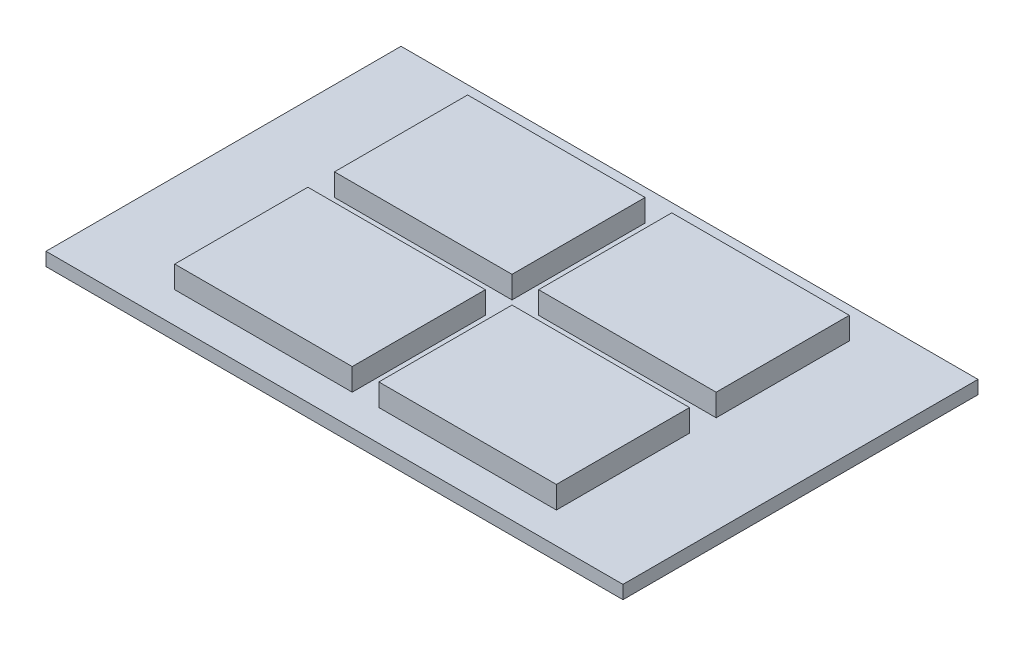
ISO-10303-21;
HEADER;
FILE_DESCRIPTION(('STEP AP214'),'2;1');
FILE_NAME('part.step','',(''),(''),'','','');
FILE_SCHEMA(('AUTOMOTIVE_DESIGN { 1 0 10303 214 1 1 1 1 }'));
ENDSEC;
DATA;
#1=APPLICATION_CONTEXT('core data for automotive mechanical design processes');
#2=APPLICATION_PROTOCOL_DEFINITION('international standard','automotive_design',2000,#1);
#3=PRODUCT_CONTEXT('',#1,'mechanical');
#4=PRODUCT('Part','Part','',(#3));
#5=PRODUCT_RELATED_PRODUCT_CATEGORY('part','',(#4));
#6=PRODUCT_DEFINITION_FORMATION('','',#4);
#7=PRODUCT_DEFINITION_CONTEXT('part definition',#1,'design');
#8=PRODUCT_DEFINITION('design','',#6,#7);
#9=PRODUCT_DEFINITION_SHAPE('','',#8);
#10=(LENGTH_UNIT() NAMED_UNIT(*) SI_UNIT(.MILLI.,.METRE.));
#11=(NAMED_UNIT(*) PLANE_ANGLE_UNIT() SI_UNIT($,.RADIAN.));
#12=(NAMED_UNIT(*) SI_UNIT($,.STERADIAN.) SOLID_ANGLE_UNIT());
#13=UNCERTAINTY_MEASURE_WITH_UNIT(LENGTH_MEASURE(1.E-05),#10,'distance_accuracy_value','');
#14=(GEOMETRIC_REPRESENTATION_CONTEXT(3) GLOBAL_UNCERTAINTY_ASSIGNED_CONTEXT((#13)) GLOBAL_UNIT_ASSIGNED_CONTEXT((#10,
#11,#12)) REPRESENTATION_CONTEXT('',''));
#15=CARTESIAN_POINT('',(0.,0.,0.));
#16=DIRECTION('',(0.,0.,1.));
#17=DIRECTION('',(1.,0.,0.));
#18=AXIS2_PLACEMENT_3D('',#15,#16,#17);
#19=CARTESIAN_POINT('',(0.,3.,0.));
#20=DIRECTION('',(0.,-1.,0.));
#21=DIRECTION('',(0.,0.,-1.));
#22=AXIS2_PLACEMENT_3D('',#19,#20,#21);
#23=PLANE('',#22);
#24=DIRECTION('',(0.,0.,-1.));
#25=VECTOR('',#24,1.);
#26=CARTESIAN_POINT('',(43.,3.,33.));
#27=LINE('',#26,#25);
#28=CARTESIAN_POINT('',(43.,3.,33.));
#29=VERTEX_POINT('',#28);
#30=CARTESIAN_POINT('',(43.,3.,2.99999999999999));
#31=VERTEX_POINT('',#30);
#32=EDGE_CURVE('E201',#29,#31,#27,.T.);
#33=ORIENTED_EDGE('',*,*,#32,.F.);
#34=DIRECTION('',(1.,0.,0.));
#35=VECTOR('',#34,1.);
#36=CARTESIAN_POINT('',(43.,3.,33.));
#37=LINE('',#36,#35);
#38=CARTESIAN_POINT('',(2.99999999999998,3.,33.));
#39=VERTEX_POINT('',#38);
#40=EDGE_CURVE('E217',#39,#29,#37,.T.);
#41=ORIENTED_EDGE('',*,*,#40,.F.);
#42=DIRECTION('',(0.,0.,1.));
#43=VECTOR('',#42,1.);
#44=CARTESIAN_POINT('',(2.99999999999998,3.,33.));
#45=LINE('',#44,#43);
#46=CARTESIAN_POINT('',(2.99999999999999,3.,2.99999999999997));
#47=VERTEX_POINT('',#46);
#48=EDGE_CURVE('E230',#47,#39,#45,.T.);
#49=ORIENTED_EDGE('',*,*,#48,.F.);
#50=DIRECTION('',(-1.,0.,0.));
#51=VECTOR('',#50,1.);
#52=CARTESIAN_POINT('',(43.,3.,2.99999999999999));
#53=LINE('',#52,#51);
#54=EDGE_CURVE('E206',#31,#47,#53,.T.);
#55=ORIENTED_EDGE('',*,*,#54,.F.);
#56=EDGE_LOOP('',(#33,#41,#49,#55));
#57=FACE_BOUND('',#56,.T.);
#58=DIRECTION('',(0.,0.,-1.));
#59=VECTOR('',#58,1.);
#60=CARTESIAN_POINT('',(-3.,3.,-33.));
#61=LINE('',#60,#59);
#62=CARTESIAN_POINT('',(-3.,3.,-3.));
#63=VERTEX_POINT('',#62);
#64=CARTESIAN_POINT('',(-3.,3.,-33.));
#65=VERTEX_POINT('',#64);
#66=EDGE_CURVE('E297',#63,#65,#61,.T.);
#67=ORIENTED_EDGE('',*,*,#66,.F.);
#68=DIRECTION('',(1.,0.,0.));
#69=VECTOR('',#68,1.);
#70=CARTESIAN_POINT('',(-43.,3.,-3.));
#71=LINE('',#70,#69);
#72=CARTESIAN_POINT('',(-43.,3.,-3.));
#73=VERTEX_POINT('',#72);
#74=EDGE_CURVE('E303',#73,#63,#71,.T.);
#75=ORIENTED_EDGE('',*,*,#74,.F.);
#76=DIRECTION('',(0.,0.,1.));
#77=VECTOR('',#76,1.);
#78=CARTESIAN_POINT('',(-43.,3.,-33.));
#79=LINE('',#78,#77);
#80=CARTESIAN_POINT('',(-43.,3.,-33.));
#81=VERTEX_POINT('',#80);
#82=EDGE_CURVE('E320',#81,#73,#79,.T.);
#83=ORIENTED_EDGE('',*,*,#82,.F.);
#84=DIRECTION('',(-1.,0.,0.));
#85=VECTOR('',#84,1.);
#86=CARTESIAN_POINT('',(-43.,3.,-33.));
#87=LINE('',#86,#85);
#88=EDGE_CURVE('E316',#65,#81,#87,.T.);
#89=ORIENTED_EDGE('',*,*,#88,.F.);
#90=EDGE_LOOP('',(#67,#75,#83,#89));
#91=FACE_BOUND('',#90,.T.);
#92=DIRECTION('',(0.,0.,1.));
#93=VECTOR('',#92,1.);
#94=CARTESIAN_POINT('',(-65.,3.,-40.));
#95=LINE('',#94,#93);
#96=CARTESIAN_POINT('',(-65.,3.,-40.));
#97=VERTEX_POINT('',#96);
#98=CARTESIAN_POINT('',(-65.,3.,40.));
#99=VERTEX_POINT('',#98);
#100=EDGE_CURVE('E343',#97,#99,#95,.T.);
#101=ORIENTED_EDGE('',*,*,#100,.T.);
#102=DIRECTION('',(1.,0.,0.));
#103=VECTOR('',#102,1.);
#104=CARTESIAN_POINT('',(65.,3.,40.));
#105=LINE('',#104,#103);
#106=CARTESIAN_POINT('',(65.,3.,40.));
#107=VERTEX_POINT('',#106);
#108=EDGE_CURVE('E347',#99,#107,#105,.T.);
#109=ORIENTED_EDGE('',*,*,#108,.T.);
#110=DIRECTION('',(0.,0.,-1.));
#111=VECTOR('',#110,1.);
#112=CARTESIAN_POINT('',(65.,3.,-40.));
#113=LINE('',#112,#111);
#114=CARTESIAN_POINT('',(65.,3.,-40.));
#115=VERTEX_POINT('',#114);
#116=EDGE_CURVE('E351',#107,#115,#113,.T.);
#117=ORIENTED_EDGE('',*,*,#116,.T.);
#118=DIRECTION('',(-1.,0.,0.));
#119=VECTOR('',#118,1.);
#120=CARTESIAN_POINT('',(65.,3.,-40.));
#121=LINE('',#120,#119);
#122=EDGE_CURVE('E354',#115,#97,#121,.T.);
#123=ORIENTED_EDGE('',*,*,#122,.T.);
#124=EDGE_LOOP('',(#101,#109,#117,#123));
#125=FACE_BOUND('',#124,.T.);
#126=DIRECTION('',(0.,0.,-1.));
#127=VECTOR('',#126,1.);
#128=CARTESIAN_POINT('',(43.,3.,-33.));
#129=LINE('',#128,#127);
#130=CARTESIAN_POINT('',(43.,3.,-3.00000000000003));
#131=VERTEX_POINT('',#130);
#132=CARTESIAN_POINT('',(43.,3.,-33.));
#133=VERTEX_POINT('',#132);
#134=EDGE_CURVE('E252',#131,#133,#129,.T.);
#135=ORIENTED_EDGE('',*,*,#134,.F.);
#136=DIRECTION('',(1.,0.,0.));
#137=VECTOR('',#136,1.);
#138=CARTESIAN_POINT('',(43.,3.,-3.00000000000003));
#139=LINE('',#138,#137);
#140=CARTESIAN_POINT('',(2.99999999999999,3.,-3.));
#141=VERTEX_POINT('',#140);
#142=EDGE_CURVE('E258',#141,#131,#139,.T.);
#143=ORIENTED_EDGE('',*,*,#142,.F.);
#144=DIRECTION('',(0.,0.,1.));
#145=VECTOR('',#144,1.);
#146=CARTESIAN_POINT('',(2.99999999999998,3.,-33.));
#147=LINE('',#146,#145);
#148=CARTESIAN_POINT('',(2.99999999999998,3.,-33.));
#149=VERTEX_POINT('',#148);
#150=EDGE_CURVE('E275',#149,#141,#147,.T.);
#151=ORIENTED_EDGE('',*,*,#150,.F.);
#152=DIRECTION('',(-1.,0.,0.));
#153=VECTOR('',#152,1.);
#154=CARTESIAN_POINT('',(43.,3.,-33.));
#155=LINE('',#154,#153);
#156=EDGE_CURVE('E271',#133,#149,#155,.T.);
#157=ORIENTED_EDGE('',*,*,#156,.F.);
#158=EDGE_LOOP('',(#135,#143,#151,#157));
#159=FACE_BOUND('',#158,.T.);
#160=DIRECTION('',(1.,0.,0.));
#161=VECTOR('',#160,1.);
#162=CARTESIAN_POINT('',(-43.,3.,33.));
#163=LINE('',#162,#161);
#164=CARTESIAN_POINT('',(-43.,3.,33.));
#165=VERTEX_POINT('',#164);
#166=CARTESIAN_POINT('',(-2.99999999999999,3.,33.));
#167=VERTEX_POINT('',#166);
#168=EDGE_CURVE('E199',#165,#167,#163,.T.);
#169=ORIENTED_EDGE('',*,*,#168,.F.);
#170=DIRECTION('',(0.,0.,1.));
#171=VECTOR('',#170,1.);
#172=CARTESIAN_POINT('',(-43.,3.,33.));
#173=LINE('',#172,#171);
#174=CARTESIAN_POINT('',(-43.,3.,2.99999999999998));
#175=VERTEX_POINT('',#174);
#176=EDGE_CURVE('E196',#175,#165,#173,.T.);
#177=ORIENTED_EDGE('',*,*,#176,.F.);
#178=DIRECTION('',(-1.,0.,0.));
#179=VECTOR('',#178,1.);
#180=CARTESIAN_POINT('',(-43.,3.,2.99999999999998));
#181=LINE('',#180,#179);
#182=CARTESIAN_POINT('',(-3.,3.,2.99999999999997));
#183=VERTEX_POINT('',#182);
#184=EDGE_CURVE('E60',#183,#175,#181,.T.);
#185=ORIENTED_EDGE('',*,*,#184,.F.);
#186=DIRECTION('',(0.,0.,-1.));
#187=VECTOR('',#186,1.);
#188=CARTESIAN_POINT('',(-2.99999999999999,3.,33.));
#189=LINE('',#188,#187);
#190=EDGE_CURVE('E55',#167,#183,#189,.T.);
#191=ORIENTED_EDGE('',*,*,#190,.F.);
#192=EDGE_LOOP('',(#169,#177,#185,#191));
#193=FACE_BOUND('',#192,.T.);
#194=ADVANCED_FACE('F39',(#57,#91,#125,#159,#193),#23,.F.);
#195=CARTESIAN_POINT('',(-65.,3.,-40.));
#196=DIRECTION('',(1.,0.,0.));
#197=DIRECTION('',(0.,0.,-1.));
#198=AXIS2_PLACEMENT_3D('',#195,#196,#197);
#199=PLANE('',#198);
#200=DIRECTION('',(0.,0.,1.));
#201=VECTOR('',#200,1.);
#202=CARTESIAN_POINT('',(-65.,0.,-40.));
#203=LINE('',#202,#201);
#204=CARTESIAN_POINT('',(-65.,0.,-40.));
#205=VERTEX_POINT('',#204);
#206=CARTESIAN_POINT('',(-65.,0.,40.));
#207=VERTEX_POINT('',#206);
#208=EDGE_CURVE('E342',#205,#207,#203,.T.);
#209=ORIENTED_EDGE('',*,*,#208,.T.);
#210=DIRECTION('',(0.,-1.,0.));
#211=VECTOR('',#210,1.);
#212=CARTESIAN_POINT('',(-65.,3.,40.));
#213=LINE('',#212,#211);
#214=EDGE_CURVE('E11',#99,#207,#213,.T.);
#215=ORIENTED_EDGE('',*,*,#214,.F.);
#216=ORIENTED_EDGE('',*,*,#100,.F.);
#217=DIRECTION('',(0.,-1.,0.));
#218=VECTOR('',#217,1.);
#219=CARTESIAN_POINT('',(-65.,3.,-40.));
#220=LINE('',#219,#218);
#221=EDGE_CURVE('E357',#97,#205,#220,.T.);
#222=ORIENTED_EDGE('',*,*,#221,.T.);
#223=EDGE_LOOP('',(#209,#215,#216,#222));
#224=FACE_BOUND('',#223,.T.);
#225=ADVANCED_FACE('F41',(#224),#199,.F.);
#226=CARTESIAN_POINT('',(65.,3.,40.));
#227=DIRECTION('',(0.,0.,-1.));
#228=DIRECTION('',(-1.,0.,0.));
#229=AXIS2_PLACEMENT_3D('',#226,#227,#228);
#230=PLANE('',#229);
#231=DIRECTION('',(1.,0.,0.));
#232=VECTOR('',#231,1.);
#233=CARTESIAN_POINT('',(65.,0.,40.));
#234=LINE('',#233,#232);
#235=CARTESIAN_POINT('',(65.,0.,40.));
#236=VERTEX_POINT('',#235);
#237=EDGE_CURVE('E361',#207,#236,#234,.T.);
#238=ORIENTED_EDGE('',*,*,#237,.T.);
#239=DIRECTION('',(0.,-1.,0.));
#240=VECTOR('',#239,1.);
#241=CARTESIAN_POINT('',(65.,3.,40.));
#242=LINE('',#241,#240);
#243=EDGE_CURVE('E48',#107,#236,#242,.T.);
#244=ORIENTED_EDGE('',*,*,#243,.F.);
#245=ORIENTED_EDGE('',*,*,#108,.F.);
#246=ORIENTED_EDGE('',*,*,#214,.T.);
#247=EDGE_LOOP('',(#238,#244,#245,#246));
#248=FACE_BOUND('',#247,.T.);
#249=ADVANCED_FACE('F397',(#248),#230,.F.);
#250=CARTESIAN_POINT('',(65.,3.,-40.));
#251=DIRECTION('',(-1.,0.,0.));
#252=DIRECTION('',(0.,0.,1.));
#253=AXIS2_PLACEMENT_3D('',#250,#251,#252);
#254=PLANE('',#253);
#255=DIRECTION('',(0.,0.,-1.));
#256=VECTOR('',#255,1.);
#257=CARTESIAN_POINT('',(65.,0.,-40.));
#258=LINE('',#257,#256);
#259=CARTESIAN_POINT('',(65.,0.,-40.));
#260=VERTEX_POINT('',#259);
#261=EDGE_CURVE('E364',#236,#260,#258,.T.);
#262=ORIENTED_EDGE('',*,*,#261,.T.);
#263=DIRECTION('',(0.,-1.,0.));
#264=VECTOR('',#263,1.);
#265=CARTESIAN_POINT('',(65.,3.,-40.));
#266=LINE('',#265,#264);
#267=EDGE_CURVE('E372',#115,#260,#266,.T.);
#268=ORIENTED_EDGE('',*,*,#267,.F.);
#269=ORIENTED_EDGE('',*,*,#116,.F.);
#270=ORIENTED_EDGE('',*,*,#243,.T.);
#271=EDGE_LOOP('',(#262,#268,#269,#270));
#272=FACE_BOUND('',#271,.T.);
#273=ADVANCED_FACE('F381',(#272),#254,.F.);
#274=CARTESIAN_POINT('',(65.,3.,-40.));
#275=DIRECTION('',(0.,0.,1.));
#276=DIRECTION('',(1.,0.,0.));
#277=AXIS2_PLACEMENT_3D('',#274,#275,#276);
#278=PLANE('',#277);
#279=DIRECTION('',(-1.,0.,0.));
#280=VECTOR('',#279,1.);
#281=CARTESIAN_POINT('',(65.,0.,-40.));
#282=LINE('',#281,#280);
#283=EDGE_CURVE('E348',#260,#205,#282,.T.);
#284=ORIENTED_EDGE('',*,*,#283,.T.);
#285=ORIENTED_EDGE('',*,*,#221,.F.);
#286=ORIENTED_EDGE('',*,*,#122,.F.);
#287=ORIENTED_EDGE('',*,*,#267,.T.);
#288=EDGE_LOOP('',(#284,#285,#286,#287));
#289=FACE_BOUND('',#288,.T.);
#290=ADVANCED_FACE('F390',(#289),#278,.F.);
#291=CARTESIAN_POINT('',(0.,0.,0.));
#292=DIRECTION('',(0.,-1.,0.));
#293=DIRECTION('',(0.,0.,-1.));
#294=AXIS2_PLACEMENT_3D('',#291,#292,#293);
#295=PLANE('',#294);
#296=ORIENTED_EDGE('',*,*,#208,.F.);
#297=ORIENTED_EDGE('',*,*,#283,.F.);
#298=ORIENTED_EDGE('',*,*,#261,.F.);
#299=ORIENTED_EDGE('',*,*,#237,.F.);
#300=EDGE_LOOP('',(#296,#297,#298,#299));
#301=FACE_BOUND('',#300,.T.);
#302=ADVANCED_FACE('F387',(#301),#295,.T.);
#303=CARTESIAN_POINT('',(-3.,8.,-33.));
#304=DIRECTION('',(-1.,0.,0.));
#305=DIRECTION('',(0.,0.,1.));
#306=AXIS2_PLACEMENT_3D('',#303,#304,#305);
#307=PLANE('',#306);
#308=ORIENTED_EDGE('',*,*,#66,.T.);
#309=DIRECTION('',(0.,-1.,0.));
#310=VECTOR('',#309,1.);
#311=CARTESIAN_POINT('',(-3.,8.,-33.));
#312=LINE('',#311,#310);
#313=CARTESIAN_POINT('',(-3.,8.,-33.));
#314=VERTEX_POINT('',#313);
#315=EDGE_CURVE('E338',#314,#65,#312,.T.);
#316=ORIENTED_EDGE('',*,*,#315,.F.);
#317=DIRECTION('',(0.,0.,-1.));
#318=VECTOR('',#317,1.);
#319=CARTESIAN_POINT('',(-3.,8.,-33.));
#320=LINE('',#319,#318);
#321=CARTESIAN_POINT('',(-3.,8.,-3.));
#322=VERTEX_POINT('',#321);
#323=EDGE_CURVE('E298',#322,#314,#320,.T.);
#324=ORIENTED_EDGE('',*,*,#323,.F.);
#325=DIRECTION('',(0.,-1.,0.));
#326=VECTOR('',#325,1.);
#327=CARTESIAN_POINT('',(-3.,8.,-3.));
#328=LINE('',#327,#326);
#329=EDGE_CURVE('E312',#322,#63,#328,.T.);
#330=ORIENTED_EDGE('',*,*,#329,.T.);
#331=EDGE_LOOP('',(#308,#316,#324,#330));
#332=FACE_BOUND('',#331,.T.);
#333=ADVANCED_FACE('F414',(#332),#307,.F.);
#334=CARTESIAN_POINT('',(-43.,8.,-33.));
#335=DIRECTION('',(0.,0.,1.));
#336=DIRECTION('',(1.,0.,0.));
#337=AXIS2_PLACEMENT_3D('',#334,#335,#336);
#338=PLANE('',#337);
#339=ORIENTED_EDGE('',*,*,#88,.T.);
#340=DIRECTION('',(0.,-1.,0.));
#341=VECTOR('',#340,1.);
#342=CARTESIAN_POINT('',(-43.,8.,-33.));
#343=LINE('',#342,#341);
#344=CARTESIAN_POINT('',(-43.,8.,-33.));
#345=VERTEX_POINT('',#344);
#346=EDGE_CURVE('E334',#345,#81,#343,.T.);
#347=ORIENTED_EDGE('',*,*,#346,.F.);
#348=DIRECTION('',(-1.,0.,0.));
#349=VECTOR('',#348,1.);
#350=CARTESIAN_POINT('',(-43.,8.,-33.));
#351=LINE('',#350,#349);
#352=EDGE_CURVE('E302',#314,#345,#351,.T.);
#353=ORIENTED_EDGE('',*,*,#352,.F.);
#354=ORIENTED_EDGE('',*,*,#315,.T.);
#355=EDGE_LOOP('',(#339,#347,#353,#354));
#356=FACE_BOUND('',#355,.T.);
#357=ADVANCED_FACE('F436',(#356),#338,.F.);
#358=CARTESIAN_POINT('',(-43.,8.,-33.));
#359=DIRECTION('',(1.,0.,0.));
#360=DIRECTION('',(0.,0.,-1.));
#361=AXIS2_PLACEMENT_3D('',#358,#359,#360);
#362=PLANE('',#361);
#363=ORIENTED_EDGE('',*,*,#82,.T.);
#364=DIRECTION('',(0.,-1.,0.));
#365=VECTOR('',#364,1.);
#366=CARTESIAN_POINT('',(-43.,8.,-3.));
#367=LINE('',#366,#365);
#368=CARTESIAN_POINT('',(-43.,8.,-3.));
#369=VERTEX_POINT('',#368);
#370=EDGE_CURVE('E330',#369,#73,#367,.T.);
#371=ORIENTED_EDGE('',*,*,#370,.F.);
#372=DIRECTION('',(0.,0.,1.));
#373=VECTOR('',#372,1.);
#374=CARTESIAN_POINT('',(-43.,8.,-33.));
#375=LINE('',#374,#373);
#376=EDGE_CURVE('E306',#345,#369,#375,.T.);
#377=ORIENTED_EDGE('',*,*,#376,.F.);
#378=ORIENTED_EDGE('',*,*,#346,.T.);
#379=EDGE_LOOP('',(#363,#371,#377,#378));
#380=FACE_BOUND('',#379,.T.);
#381=ADVANCED_FACE('F442',(#380),#362,.F.);
#382=CARTESIAN_POINT('',(-43.,8.,-3.));
#383=DIRECTION('',(0.,0.,-1.));
#384=DIRECTION('',(-1.,0.,0.));
#385=AXIS2_PLACEMENT_3D('',#382,#383,#384);
#386=PLANE('',#385);
#387=ORIENTED_EDGE('',*,*,#74,.T.);
#388=ORIENTED_EDGE('',*,*,#329,.F.);
#389=DIRECTION('',(1.,0.,0.));
#390=VECTOR('',#389,1.);
#391=CARTESIAN_POINT('',(-43.,8.,-3.));
#392=LINE('',#391,#390);
#393=EDGE_CURVE('E309',#369,#322,#392,.T.);
#394=ORIENTED_EDGE('',*,*,#393,.F.);
#395=ORIENTED_EDGE('',*,*,#370,.T.);
#396=EDGE_LOOP('',(#387,#388,#394,#395));
#397=FACE_BOUND('',#396,.T.);
#398=ADVANCED_FACE('F449',(#397),#386,.F.);
#399=CARTESIAN_POINT('',(0.,8.,0.));
#400=DIRECTION('',(0.,1.,0.));
#401=DIRECTION('',(0.,0.,1.));
#402=AXIS2_PLACEMENT_3D('',#399,#400,#401);
#403=PLANE('',#402);
#404=ORIENTED_EDGE('',*,*,#323,.T.);
#405=ORIENTED_EDGE('',*,*,#352,.T.);
#406=ORIENTED_EDGE('',*,*,#376,.T.);
#407=ORIENTED_EDGE('',*,*,#393,.T.);
#408=EDGE_LOOP('',(#404,#405,#406,#407));
#409=FACE_BOUND('',#408,.T.);
#410=ADVANCED_FACE('F457',(#409),#403,.T.);
#411=CARTESIAN_POINT('',(43.,8.,-33.));
#412=DIRECTION('',(-1.,0.,0.));
#413=DIRECTION('',(0.,0.,1.));
#414=AXIS2_PLACEMENT_3D('',#411,#412,#413);
#415=PLANE('',#414);
#416=ORIENTED_EDGE('',*,*,#134,.T.);
#417=DIRECTION('',(0.,-1.,0.));
#418=VECTOR('',#417,1.);
#419=CARTESIAN_POINT('',(43.,8.,-33.));
#420=LINE('',#419,#418);
#421=CARTESIAN_POINT('',(43.,8.,-33.));
#422=VERTEX_POINT('',#421);
#423=EDGE_CURVE('E293',#422,#133,#420,.T.);
#424=ORIENTED_EDGE('',*,*,#423,.F.);
#425=DIRECTION('',(0.,0.,-1.));
#426=VECTOR('',#425,1.);
#427=CARTESIAN_POINT('',(43.,8.,-33.));
#428=LINE('',#427,#426);
#429=CARTESIAN_POINT('',(43.,8.,-3.00000000000003));
#430=VERTEX_POINT('',#429);
#431=EDGE_CURVE('E253',#430,#422,#428,.T.);
#432=ORIENTED_EDGE('',*,*,#431,.F.);
#433=DIRECTION('',(0.,-1.,0.));
#434=VECTOR('',#433,1.);
#435=CARTESIAN_POINT('',(43.,8.,-3.00000000000003));
#436=LINE('',#435,#434);
#437=EDGE_CURVE('E267',#430,#131,#436,.T.);
#438=ORIENTED_EDGE('',*,*,#437,.T.);
#439=EDGE_LOOP('',(#416,#424,#432,#438));
#440=FACE_BOUND('',#439,.T.);
#441=ADVANCED_FACE('F465',(#440),#415,.F.);
#442=CARTESIAN_POINT('',(43.,8.,-33.));
#443=DIRECTION('',(0.,0.,1.));
#444=DIRECTION('',(1.,0.,0.));
#445=AXIS2_PLACEMENT_3D('',#442,#443,#444);
#446=PLANE('',#445);
#447=ORIENTED_EDGE('',*,*,#156,.T.);
#448=DIRECTION('',(0.,-1.,0.));
#449=VECTOR('',#448,1.);
#450=CARTESIAN_POINT('',(2.99999999999998,8.,-33.));
#451=LINE('',#450,#449);
#452=CARTESIAN_POINT('',(2.99999999999998,8.,-33.));
#453=VERTEX_POINT('',#452);
#454=EDGE_CURVE('E289',#453,#149,#451,.T.);
#455=ORIENTED_EDGE('',*,*,#454,.F.);
#456=DIRECTION('',(-1.,0.,0.));
#457=VECTOR('',#456,1.);
#458=CARTESIAN_POINT('',(43.,8.,-33.));
#459=LINE('',#458,#457);
#460=EDGE_CURVE('E257',#422,#453,#459,.T.);
#461=ORIENTED_EDGE('',*,*,#460,.F.);
#462=ORIENTED_EDGE('',*,*,#423,.T.);
#463=EDGE_LOOP('',(#447,#455,#461,#462));
#464=FACE_BOUND('',#463,.T.);
#465=ADVANCED_FACE('F473',(#464),#446,.F.);
#466=CARTESIAN_POINT('',(2.99999999999998,8.,-33.));
#467=DIRECTION('',(1.,0.,0.));
#468=DIRECTION('',(0.,0.,-1.));
#469=AXIS2_PLACEMENT_3D('',#466,#467,#468);
#470=PLANE('',#469);
#471=ORIENTED_EDGE('',*,*,#150,.T.);
#472=DIRECTION('',(0.,-1.,0.));
#473=VECTOR('',#472,1.);
#474=CARTESIAN_POINT('',(2.99999999999999,8.,-3.));
#475=LINE('',#474,#473);
#476=CARTESIAN_POINT('',(2.99999999999999,8.,-3.));
#477=VERTEX_POINT('',#476);
#478=EDGE_CURVE('E285',#477,#141,#475,.T.);
#479=ORIENTED_EDGE('',*,*,#478,.F.);
#480=DIRECTION('',(0.,0.,1.));
#481=VECTOR('',#480,1.);
#482=CARTESIAN_POINT('',(2.99999999999998,8.,-33.));
#483=LINE('',#482,#481);
#484=EDGE_CURVE('E261',#453,#477,#483,.T.);
#485=ORIENTED_EDGE('',*,*,#484,.F.);
#486=ORIENTED_EDGE('',*,*,#454,.T.);
#487=EDGE_LOOP('',(#471,#479,#485,#486));
#488=FACE_BOUND('',#487,.T.);
#489=ADVANCED_FACE('F481',(#488),#470,.F.);
#490=CARTESIAN_POINT('',(43.,8.,-3.00000000000003));
#491=DIRECTION('',(0.,0.,-1.));
#492=DIRECTION('',(-1.,0.,0.));
#493=AXIS2_PLACEMENT_3D('',#490,#491,#492);
#494=PLANE('',#493);
#495=ORIENTED_EDGE('',*,*,#142,.T.);
#496=ORIENTED_EDGE('',*,*,#437,.F.);
#497=DIRECTION('',(1.,0.,0.));
#498=VECTOR('',#497,1.);
#499=CARTESIAN_POINT('',(43.,8.,-3.00000000000003));
#500=LINE('',#499,#498);
#501=EDGE_CURVE('E264',#477,#430,#500,.T.);
#502=ORIENTED_EDGE('',*,*,#501,.F.);
#503=ORIENTED_EDGE('',*,*,#478,.T.);
#504=EDGE_LOOP('',(#495,#496,#502,#503));
#505=FACE_BOUND('',#504,.T.);
#506=ADVANCED_FACE('F489',(#505),#494,.F.);
#507=CARTESIAN_POINT('',(0.,8.,0.));
#508=DIRECTION('',(0.,-1.,0.));
#509=DIRECTION('',(0.,0.,-1.));
#510=AXIS2_PLACEMENT_3D('',#507,#508,#509);
#511=PLANE('',#510);
#512=ORIENTED_EDGE('',*,*,#431,.T.);
#513=ORIENTED_EDGE('',*,*,#460,.T.);
#514=ORIENTED_EDGE('',*,*,#484,.T.);
#515=ORIENTED_EDGE('',*,*,#501,.T.);
#516=EDGE_LOOP('',(#512,#513,#514,#515));
#517=FACE_BOUND('',#516,.T.);
#518=ADVANCED_FACE('F497',(#517),#511,.F.);
#519=CARTESIAN_POINT('',(43.,8.,33.));
#520=DIRECTION('',(-1.,0.,0.));
#521=DIRECTION('',(0.,0.,1.));
#522=AXIS2_PLACEMENT_3D('',#519,#520,#521);
#523=PLANE('',#522);
#524=ORIENTED_EDGE('',*,*,#32,.T.);
#525=DIRECTION('',(0.,-1.,0.));
#526=VECTOR('',#525,1.);
#527=CARTESIAN_POINT('',(43.,8.,2.99999999999999));
#528=LINE('',#527,#526);
#529=CARTESIAN_POINT('',(43.,8.,2.99999999999999));
#530=VERTEX_POINT('',#529);
#531=EDGE_CURVE('E248',#530,#31,#528,.T.);
#532=ORIENTED_EDGE('',*,*,#531,.F.);
#533=DIRECTION('',(0.,0.,-1.));
#534=VECTOR('',#533,1.);
#535=CARTESIAN_POINT('',(43.,8.,33.));
#536=LINE('',#535,#534);
#537=CARTESIAN_POINT('',(43.,8.,33.));
#538=VERTEX_POINT('',#537);
#539=EDGE_CURVE('E212',#538,#530,#536,.T.);
#540=ORIENTED_EDGE('',*,*,#539,.F.);
#541=DIRECTION('',(0.,-1.,0.));
#542=VECTOR('',#541,1.);
#543=CARTESIAN_POINT('',(43.,8.,33.));
#544=LINE('',#543,#542);
#545=EDGE_CURVE('E225',#538,#29,#544,.T.);
#546=ORIENTED_EDGE('',*,*,#545,.T.);
#547=EDGE_LOOP('',(#524,#532,#540,#546));
#548=FACE_BOUND('',#547,.T.);
#549=ADVANCED_FACE('F505',(#548),#523,.F.);
#550=CARTESIAN_POINT('',(43.,8.,2.99999999999999));
#551=DIRECTION('',(0.,0.,1.));
#552=DIRECTION('',(1.,0.,0.));
#553=AXIS2_PLACEMENT_3D('',#550,#551,#552);
#554=PLANE('',#553);
#555=ORIENTED_EDGE('',*,*,#54,.T.);
#556=DIRECTION('',(0.,-1.,0.));
#557=VECTOR('',#556,1.);
#558=CARTESIAN_POINT('',(2.99999999999999,8.,2.99999999999997));
#559=LINE('',#558,#557);
#560=CARTESIAN_POINT('',(2.99999999999999,8.,2.99999999999997));
#561=VERTEX_POINT('',#560);
#562=EDGE_CURVE('E244',#561,#47,#559,.T.);
#563=ORIENTED_EDGE('',*,*,#562,.F.);
#564=DIRECTION('',(-1.,0.,0.));
#565=VECTOR('',#564,1.);
#566=CARTESIAN_POINT('',(43.,8.,2.99999999999999));
#567=LINE('',#566,#565);
#568=EDGE_CURVE('E216',#530,#561,#567,.T.);
#569=ORIENTED_EDGE('',*,*,#568,.F.);
#570=ORIENTED_EDGE('',*,*,#531,.T.);
#571=EDGE_LOOP('',(#555,#563,#569,#570));
#572=FACE_BOUND('',#571,.T.);
#573=ADVANCED_FACE('F513',(#572),#554,.F.);
#574=CARTESIAN_POINT('',(2.99999999999998,8.,33.));
#575=DIRECTION('',(1.,0.,0.));
#576=DIRECTION('',(0.,0.,-1.));
#577=AXIS2_PLACEMENT_3D('',#574,#575,#576);
#578=PLANE('',#577);
#579=ORIENTED_EDGE('',*,*,#48,.T.);
#580=DIRECTION('',(0.,-1.,0.));
#581=VECTOR('',#580,1.);
#582=CARTESIAN_POINT('',(2.99999999999998,8.,33.));
#583=LINE('',#582,#581);
#584=CARTESIAN_POINT('',(2.99999999999998,8.,33.));
#585=VERTEX_POINT('',#584);
#586=EDGE_CURVE('E240',#585,#39,#583,.T.);
#587=ORIENTED_EDGE('',*,*,#586,.F.);
#588=DIRECTION('',(0.,0.,1.));
#589=VECTOR('',#588,1.);
#590=CARTESIAN_POINT('',(2.99999999999998,8.,33.));
#591=LINE('',#590,#589);
#592=EDGE_CURVE('E220',#561,#585,#591,.T.);
#593=ORIENTED_EDGE('',*,*,#592,.F.);
#594=ORIENTED_EDGE('',*,*,#562,.T.);
#595=EDGE_LOOP('',(#579,#587,#593,#594));
#596=FACE_BOUND('',#595,.T.);
#597=ADVANCED_FACE('F521',(#596),#578,.F.);
#598=CARTESIAN_POINT('',(43.,8.,33.));
#599=DIRECTION('',(0.,0.,-1.));
#600=DIRECTION('',(-1.,0.,0.));
#601=AXIS2_PLACEMENT_3D('',#598,#599,#600);
#602=PLANE('',#601);
#603=ORIENTED_EDGE('',*,*,#40,.T.);
#604=ORIENTED_EDGE('',*,*,#545,.F.);
#605=DIRECTION('',(1.,0.,0.));
#606=VECTOR('',#605,1.);
#607=CARTESIAN_POINT('',(43.,8.,33.));
#608=LINE('',#607,#606);
#609=EDGE_CURVE('E223',#585,#538,#608,.T.);
#610=ORIENTED_EDGE('',*,*,#609,.F.);
#611=ORIENTED_EDGE('',*,*,#586,.T.);
#612=EDGE_LOOP('',(#603,#604,#610,#611));
#613=FACE_BOUND('',#612,.T.);
#614=ADVANCED_FACE('F529',(#613),#602,.F.);
#615=CARTESIAN_POINT('',(0.,8.,0.));
#616=DIRECTION('',(0.,1.,0.));
#617=DIRECTION('',(0.,0.,1.));
#618=AXIS2_PLACEMENT_3D('',#615,#616,#617);
#619=PLANE('',#618);
#620=ORIENTED_EDGE('',*,*,#539,.T.);
#621=ORIENTED_EDGE('',*,*,#568,.T.);
#622=ORIENTED_EDGE('',*,*,#592,.T.);
#623=ORIENTED_EDGE('',*,*,#609,.T.);
#624=EDGE_LOOP('',(#620,#621,#622,#623));
#625=FACE_BOUND('',#624,.T.);
#626=ADVANCED_FACE('F537',(#625),#619,.T.);
#627=CARTESIAN_POINT('',(-43.,8.,33.));
#628=DIRECTION('',(0.,0.,-1.));
#629=DIRECTION('',(-1.,0.,0.));
#630=AXIS2_PLACEMENT_3D('',#627,#628,#629);
#631=PLANE('',#630);
#632=ORIENTED_EDGE('',*,*,#168,.T.);
#633=DIRECTION('',(0.,-1.,0.));
#634=VECTOR('',#633,1.);
#635=CARTESIAN_POINT('',(-2.99999999999999,8.,33.));
#636=LINE('',#635,#634);
#637=CARTESIAN_POINT('',(-2.99999999999999,8.,33.));
#638=VERTEX_POINT('',#637);
#639=EDGE_CURVE('E178',#638,#167,#636,.T.);
#640=ORIENTED_EDGE('',*,*,#639,.F.);
#641=DIRECTION('',(1.,0.,0.));
#642=VECTOR('',#641,1.);
#643=CARTESIAN_POINT('',(-43.,8.,33.));
#644=LINE('',#643,#642);
#645=CARTESIAN_POINT('',(-43.,8.,33.));
#646=VERTEX_POINT('',#645);
#647=EDGE_CURVE('E186',#646,#638,#644,.T.);
#648=ORIENTED_EDGE('',*,*,#647,.F.);
#649=DIRECTION('',(0.,-1.,0.));
#650=VECTOR('',#649,1.);
#651=CARTESIAN_POINT('',(-43.,8.,33.));
#652=LINE('',#651,#650);
#653=EDGE_CURVE('E624',#646,#165,#652,.T.);
#654=ORIENTED_EDGE('',*,*,#653,.T.);
#655=EDGE_LOOP('',(#632,#640,#648,#654));
#656=FACE_BOUND('',#655,.T.);
#657=ADVANCED_FACE('F198',(#656),#631,.F.);
#658=CARTESIAN_POINT('',(-2.99999999999999,8.,33.));
#659=DIRECTION('',(-1.,0.,0.));
#660=DIRECTION('',(0.,0.,1.));
#661=AXIS2_PLACEMENT_3D('',#658,#659,#660);
#662=PLANE('',#661);
#663=ORIENTED_EDGE('',*,*,#190,.T.);
#664=DIRECTION('',(0.,-1.,0.));
#665=VECTOR('',#664,1.);
#666=CARTESIAN_POINT('',(-3.,8.,2.99999999999997));
#667=LINE('',#666,#665);
#668=CARTESIAN_POINT('',(-3.,8.,2.99999999999997));
#669=VERTEX_POINT('',#668);
#670=EDGE_CURVE('E181',#669,#183,#667,.T.);
#671=ORIENTED_EDGE('',*,*,#670,.F.);
#672=DIRECTION('',(0.,0.,-1.));
#673=VECTOR('',#672,1.);
#674=CARTESIAN_POINT('',(-2.99999999999999,8.,33.));
#675=LINE('',#674,#673);
#676=EDGE_CURVE('E174',#638,#669,#675,.T.);
#677=ORIENTED_EDGE('',*,*,#676,.F.);
#678=ORIENTED_EDGE('',*,*,#639,.T.);
#679=EDGE_LOOP('',(#663,#671,#677,#678));
#680=FACE_BOUND('',#679,.T.);
#681=ADVANCED_FACE('F176',(#680),#662,.F.);
#682=CARTESIAN_POINT('',(-43.,8.,2.99999999999998));
#683=DIRECTION('',(0.,0.,1.));
#684=DIRECTION('',(1.,0.,0.));
#685=AXIS2_PLACEMENT_3D('',#682,#683,#684);
#686=PLANE('',#685);
#687=ORIENTED_EDGE('',*,*,#184,.T.);
#688=DIRECTION('',(0.,-1.,0.));
#689=VECTOR('',#688,1.);
#690=CARTESIAN_POINT('',(-43.,8.,2.99999999999998));
#691=LINE('',#690,#689);
#692=CARTESIAN_POINT('',(-43.,8.,2.99999999999998));
#693=VERTEX_POINT('',#692);
#694=EDGE_CURVE('E208',#693,#175,#691,.T.);
#695=ORIENTED_EDGE('',*,*,#694,.F.);
#696=DIRECTION('',(-1.,0.,0.));
#697=VECTOR('',#696,1.);
#698=CARTESIAN_POINT('',(-43.,8.,2.99999999999998));
#699=LINE('',#698,#697);
#700=EDGE_CURVE('E185',#669,#693,#699,.T.);
#701=ORIENTED_EDGE('',*,*,#700,.F.);
#702=ORIENTED_EDGE('',*,*,#670,.T.);
#703=EDGE_LOOP('',(#687,#695,#701,#702));
#704=FACE_BOUND('',#703,.T.);
#705=ADVANCED_FACE('F558',(#704),#686,.F.);
#706=CARTESIAN_POINT('',(-43.,8.,33.));
#707=DIRECTION('',(1.,0.,0.));
#708=DIRECTION('',(0.,0.,-1.));
#709=AXIS2_PLACEMENT_3D('',#706,#707,#708);
#710=PLANE('',#709);
#711=ORIENTED_EDGE('',*,*,#176,.T.);
#712=ORIENTED_EDGE('',*,*,#653,.F.);
#713=DIRECTION('',(0.,0.,1.));
#714=VECTOR('',#713,1.);
#715=CARTESIAN_POINT('',(-43.,8.,33.));
#716=LINE('',#715,#714);
#717=EDGE_CURVE('E191',#693,#646,#716,.T.);
#718=ORIENTED_EDGE('',*,*,#717,.F.);
#719=ORIENTED_EDGE('',*,*,#694,.T.);
#720=EDGE_LOOP('',(#711,#712,#718,#719));
#721=FACE_BOUND('',#720,.T.);
#722=ADVANCED_FACE('F565',(#721),#710,.F.);
#723=CARTESIAN_POINT('',(0.,8.,0.));
#724=DIRECTION('',(0.,1.,0.));
#725=DIRECTION('',(0.,0.,1.));
#726=AXIS2_PLACEMENT_3D('',#723,#724,#725);
#727=PLANE('',#726);
#728=ORIENTED_EDGE('',*,*,#647,.T.);
#729=ORIENTED_EDGE('',*,*,#676,.T.);
#730=ORIENTED_EDGE('',*,*,#700,.T.);
#731=ORIENTED_EDGE('',*,*,#717,.T.);
#732=EDGE_LOOP('',(#728,#729,#730,#731));
#733=FACE_BOUND('',#732,.T.);
#734=ADVANCED_FACE('F189',(#733),#727,.T.);
#735=CLOSED_SHELL('',(#194,#225,#249,#273,#290,#302,#333,#357,#381,#398,#410,#441,#465,#489,
#506,#518,#549,#573,#597,#614,#626,#657,#681,#705,#722,#734));
#736=MANIFOLD_SOLID_BREP('B2',#735);
#737=ADVANCED_BREP_SHAPE_REPRESENTATION('',(#18,#736),#14);
#738=SHAPE_DEFINITION_REPRESENTATION(#9,#737);
ENDSEC;
END-ISO-10303-21;
